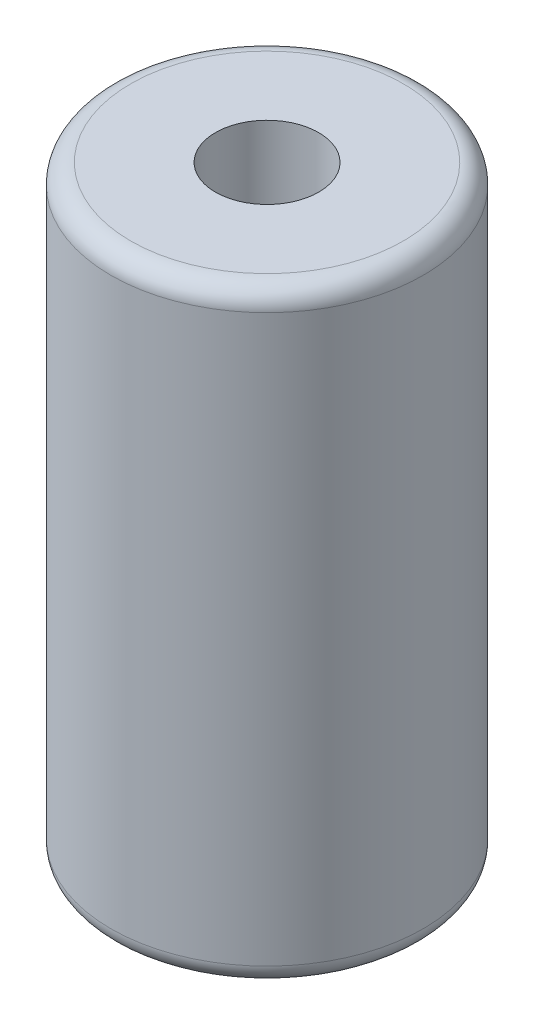
ISO-10303-21;
HEADER;
FILE_DESCRIPTION(('STEP AP214'),'2;1');
FILE_NAME('part.step','',(''),(''),'','','');
FILE_SCHEMA(('AUTOMOTIVE_DESIGN { 1 0 10303 214 1 1 1 1 }'));
ENDSEC;
DATA;
#1=APPLICATION_CONTEXT('core data for automotive mechanical design processes');
#2=APPLICATION_PROTOCOL_DEFINITION('international standard','automotive_design',2000,#1);
#3=PRODUCT_CONTEXT('',#1,'mechanical');
#4=PRODUCT('Part','Part','',(#3));
#5=PRODUCT_RELATED_PRODUCT_CATEGORY('part','',(#4));
#6=PRODUCT_DEFINITION_FORMATION('','',#4);
#7=PRODUCT_DEFINITION_CONTEXT('part definition',#1,'design');
#8=PRODUCT_DEFINITION('design','',#6,#7);
#9=PRODUCT_DEFINITION_SHAPE('','',#8);
#10=(LENGTH_UNIT() NAMED_UNIT(*) SI_UNIT(.MILLI.,.METRE.));
#11=(NAMED_UNIT(*) PLANE_ANGLE_UNIT() SI_UNIT($,.RADIAN.));
#12=(NAMED_UNIT(*) SI_UNIT($,.STERADIAN.) SOLID_ANGLE_UNIT());
#13=UNCERTAINTY_MEASURE_WITH_UNIT(LENGTH_MEASURE(1.E-05),#10,'distance_accuracy_value','');
#14=(GEOMETRIC_REPRESENTATION_CONTEXT(3) GLOBAL_UNCERTAINTY_ASSIGNED_CONTEXT((#13)) GLOBAL_UNIT_ASSIGNED_CONTEXT((#10,
#11,#12)) REPRESENTATION_CONTEXT('',''));
#15=CARTESIAN_POINT('',(0.,0.,0.));
#16=DIRECTION('',(0.,0.,1.));
#17=DIRECTION('',(1.,0.,0.));
#18=AXIS2_PLACEMENT_3D('',#15,#16,#17);
#19=CARTESIAN_POINT('',(0.,12.317,0.));
#20=DIRECTION('',(0.,1.,0.));
#21=DIRECTION('',(0.,0.,1.));
#22=AXIS2_PLACEMENT_3D('',#19,#20,#21);
#23=PLANE('',#22);
#24=CARTESIAN_POINT('',(0.,12.317,0.));
#25=DIRECTION('',(0.,1.,0.));
#26=DIRECTION('',(0.,0.,1.));
#27=AXIS2_PLACEMENT_3D('',#24,#25,#26);
#28=CIRCLE('',#27,2.7718253968254);
#29=CARTESIAN_POINT('',(0.,12.317,2.7718253968254));
#30=VERTEX_POINT('',#29);
#31=EDGE_CURVE('E10',#30,#30,#28,.T.);
#32=ORIENTED_EDGE('',*,*,#31,.T.);
#33=EDGE_LOOP('',(#32));
#34=FACE_BOUND('',#33,.T.);
#35=CARTESIAN_POINT('',(0.,12.317,0.));
#36=DIRECTION('',(0.,1.,0.));
#37=DIRECTION('',(0.,0.,1.));
#38=AXIS2_PLACEMENT_3D('',#35,#36,#37);
#39=CIRCLE('',#38,1.05);
#40=CARTESIAN_POINT('',(0.,12.317,1.05));
#41=VERTEX_POINT('',#40);
#42=EDGE_CURVE('E61',#41,#41,#39,.T.);
#43=ORIENTED_EDGE('',*,*,#42,.F.);
#44=EDGE_LOOP('',(#43));
#45=FACE_BOUND('',#44,.T.);
#46=ADVANCED_FACE('F37',(#34,#45),#23,.T.);
#47=CARTESIAN_POINT('',(0.,0.,0.));
#48=DIRECTION('',(0.,1.,0.));
#49=DIRECTION('',(0.,0.,1.));
#50=AXIS2_PLACEMENT_3D('',#47,#48,#49);
#51=PLANE('',#50);
#52=CARTESIAN_POINT('',(0.,0.,0.));
#53=DIRECTION('',(0.,1.,0.));
#54=DIRECTION('',(0.,0.,1.));
#55=AXIS2_PLACEMENT_3D('',#52,#53,#54);
#56=CIRCLE('',#55,2.7718253968254);
#57=CARTESIAN_POINT('',(0.,0.,2.7718253968254));
#58=VERTEX_POINT('',#57);
#59=EDGE_CURVE('E45',#58,#58,#56,.F.);
#60=ORIENTED_EDGE('',*,*,#59,.T.);
#61=EDGE_LOOP('',(#60));
#62=FACE_BOUND('',#61,.T.);
#63=CARTESIAN_POINT('',(0.,0.,0.));
#64=DIRECTION('',(0.,1.,0.));
#65=DIRECTION('',(0.,0.,1.));
#66=AXIS2_PLACEMENT_3D('',#63,#64,#65);
#67=CIRCLE('',#66,1.05);
#68=CARTESIAN_POINT('',(0.,0.,1.05));
#69=VERTEX_POINT('',#68);
#70=EDGE_CURVE('E62',#69,#69,#67,.T.);
#71=ORIENTED_EDGE('',*,*,#70,.T.);
#72=EDGE_LOOP('',(#71));
#73=FACE_BOUND('',#72,.T.);
#74=ADVANCED_FACE('F74',(#62,#73),#51,.F.);
#75=CARTESIAN_POINT('',(0.,12.317,0.));
#76=DIRECTION('',(0.,-1.,0.));
#77=DIRECTION('',(0.,0.,-1.));
#78=AXIS2_PLACEMENT_3D('',#75,#76,#77);
#79=CYLINDRICAL_SURFACE('',#78,3.175);
#80=CARTESIAN_POINT('',(0.,0.403174603174603,0.));
#81=DIRECTION('',(0.,1.,0.));
#82=DIRECTION('',(0.,0.,1.));
#83=AXIS2_PLACEMENT_3D('',#80,#81,#82);
#84=CIRCLE('',#83,3.175);
#85=CARTESIAN_POINT('',(0.,0.403174603174603,3.175));
#86=VERTEX_POINT('',#85);
#87=EDGE_CURVE('E50',#86,#86,#84,.T.);
#88=ORIENTED_EDGE('',*,*,#87,.T.);
#89=EDGE_LOOP('',(#88));
#90=FACE_BOUND('',#89,.T.);
#91=CARTESIAN_POINT('',(0.,11.9138253968254,0.));
#92=DIRECTION('',(0.,1.,0.));
#93=DIRECTION('',(0.,0.,1.));
#94=AXIS2_PLACEMENT_3D('',#91,#92,#93);
#95=CIRCLE('',#94,3.175);
#96=CARTESIAN_POINT('',(0.,11.9138253968254,3.175));
#97=VERTEX_POINT('',#96);
#98=EDGE_CURVE('E55',#97,#97,#95,.F.);
#99=ORIENTED_EDGE('',*,*,#98,.T.);
#100=EDGE_LOOP('',(#99));
#101=FACE_BOUND('',#100,.T.);
#102=ADVANCED_FACE('F79',(#90,#101),#79,.T.);
#103=CARTESIAN_POINT('',(0.,12.317,0.));
#104=DIRECTION('',(0.,-1.,0.));
#105=DIRECTION('',(0.,0.,-1.));
#106=AXIS2_PLACEMENT_3D('',#103,#104,#105);
#107=CYLINDRICAL_SURFACE('',#106,1.05);
#108=ORIENTED_EDGE('',*,*,#42,.T.);
#109=EDGE_LOOP('',(#108));
#110=FACE_BOUND('',#109,.T.);
#111=ORIENTED_EDGE('',*,*,#70,.F.);
#112=EDGE_LOOP('',(#111));
#113=FACE_BOUND('',#112,.T.);
#114=ADVANCED_FACE('F70',(#110,#113),#107,.F.);
#115=CARTESIAN_POINT('',(0.,0.403174603174603,0.));
#116=DIRECTION('',(0.,1.,0.));
#117=DIRECTION('',(0.,0.,1.));
#118=AXIS2_PLACEMENT_3D('',#115,#116,#117);
#119=TOROIDAL_SURFACE('',#118,2.7718253968254,0.403174603174603);
#120=ORIENTED_EDGE('',*,*,#59,.F.);
#121=EDGE_LOOP('',(#120));
#122=FACE_BOUND('',#121,.T.);
#123=ORIENTED_EDGE('',*,*,#87,.F.);
#124=EDGE_LOOP('',(#123));
#125=FACE_BOUND('',#124,.T.);
#126=ADVANCED_FACE('F85',(#122,#125),#119,.T.);
#127=CARTESIAN_POINT('',(0.,11.9138253968254,0.));
#128=DIRECTION('',(0.,1.,0.));
#129=DIRECTION('',(0.,0.,1.));
#130=AXIS2_PLACEMENT_3D('',#127,#128,#129);
#131=TOROIDAL_SURFACE('',#130,2.7718253968254,0.403174603174603);
#132=ORIENTED_EDGE('',*,*,#98,.F.);
#133=EDGE_LOOP('',(#132));
#134=FACE_BOUND('',#133,.T.);
#135=ORIENTED_EDGE('',*,*,#31,.F.);
#136=EDGE_LOOP('',(#135));
#137=FACE_BOUND('',#136,.T.);
#138=ADVANCED_FACE('F39',(#134,#137),#131,.T.);
#139=CLOSED_SHELL('',(#46,#74,#102,#114,#126,#138));
#140=MANIFOLD_SOLID_BREP('B2',#139);
#141=ADVANCED_BREP_SHAPE_REPRESENTATION('',(#18,#140),#14);
#142=SHAPE_DEFINITION_REPRESENTATION(#9,#141);
ENDSEC;
END-ISO-10303-21;
